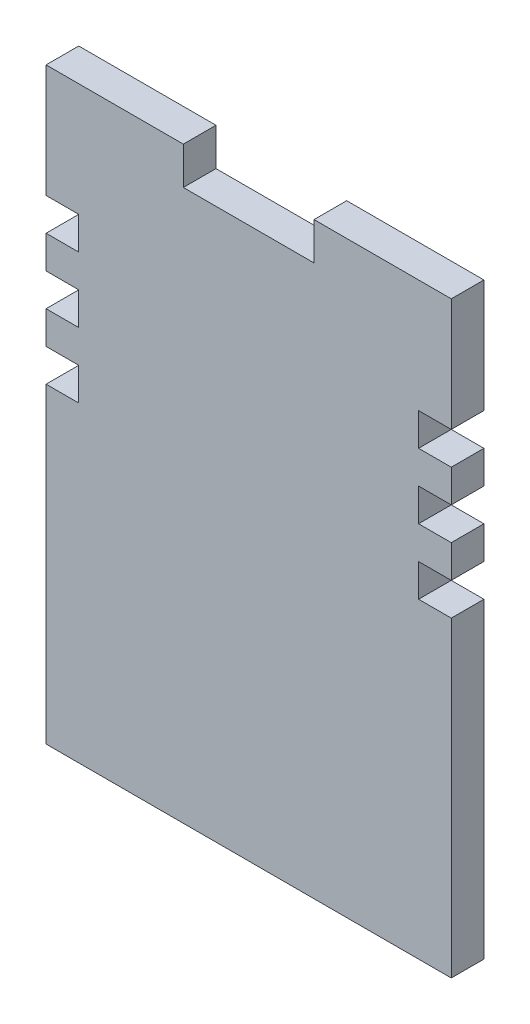
ISO-10303-21;
HEADER;
FILE_DESCRIPTION(('STEP AP214'),'2;1');
FILE_NAME('part.step','',(''),(''),'','','');
FILE_SCHEMA(('AUTOMOTIVE_DESIGN { 1 0 10303 214 1 1 1 1 }'));
ENDSEC;
DATA;
#1=APPLICATION_CONTEXT('core data for automotive mechanical design processes');
#2=APPLICATION_PROTOCOL_DEFINITION('international standard','automotive_design',2000,#1);
#3=PRODUCT_CONTEXT('',#1,'mechanical');
#4=PRODUCT('Part','Part','',(#3));
#5=PRODUCT_RELATED_PRODUCT_CATEGORY('part','',(#4));
#6=PRODUCT_DEFINITION_FORMATION('','',#4);
#7=PRODUCT_DEFINITION_CONTEXT('part definition',#1,'design');
#8=PRODUCT_DEFINITION('design','',#6,#7);
#9=PRODUCT_DEFINITION_SHAPE('','',#8);
#10=(LENGTH_UNIT() NAMED_UNIT(*) SI_UNIT(.MILLI.,.METRE.));
#11=(NAMED_UNIT(*) PLANE_ANGLE_UNIT() SI_UNIT($,.RADIAN.));
#12=(NAMED_UNIT(*) SI_UNIT($,.STERADIAN.) SOLID_ANGLE_UNIT());
#13=UNCERTAINTY_MEASURE_WITH_UNIT(LENGTH_MEASURE(1.E-05),#10,'distance_accuracy_value','');
#14=(GEOMETRIC_REPRESENTATION_CONTEXT(3) GLOBAL_UNCERTAINTY_ASSIGNED_CONTEXT((#13)) GLOBAL_UNIT_ASSIGNED_CONTEXT((#10,
#11,#12)) REPRESENTATION_CONTEXT('',''));
#15=CARTESIAN_POINT('',(0.,0.,0.));
#16=DIRECTION('',(0.,0.,1.));
#17=DIRECTION('',(1.,0.,0.));
#18=AXIS2_PLACEMENT_3D('',#15,#16,#17);
#19=CARTESIAN_POINT('',(0.,76.8543070466195,5.));
#20=DIRECTION('',(0.,1.,0.));
#21=DIRECTION('',(0.,0.,1.));
#22=AXIS2_PLACEMENT_3D('',#19,#20,#21);
#23=PLANE('',#22);
#24=DIRECTION('',(1.,0.,0.));
#25=VECTOR('',#24,1.);
#26=CARTESIAN_POINT('',(0.,76.8543070466195,0.));
#27=LINE('',#26,#25);
#28=CARTESIAN_POINT('',(30.4360171170788,76.8543070466195,0.));
#29=VERTEX_POINT('',#28);
#30=CARTESIAN_POINT('',(92.4360171170788,76.8543070466195,0.));
#31=VERTEX_POINT('',#30);
#32=EDGE_CURVE('E276',#29,#31,#27,.T.);
#33=ORIENTED_EDGE('',*,*,#32,.T.);
#34=DIRECTION('',(0.,0.,-1.));
#35=VECTOR('',#34,1.);
#36=CARTESIAN_POINT('',(92.4360171170788,76.8543070466195,5.));
#37=LINE('',#36,#35);
#38=CARTESIAN_POINT('',(92.4360171170788,76.8543070466195,5.));
#39=VERTEX_POINT('',#38);
#40=EDGE_CURVE('E11',#39,#31,#37,.T.);
#41=ORIENTED_EDGE('',*,*,#40,.F.);
#42=DIRECTION('',(1.,0.,0.));
#43=VECTOR('',#42,1.);
#44=CARTESIAN_POINT('',(0.,76.8543070466195,5.));
#45=LINE('',#44,#43);
#46=CARTESIAN_POINT('',(30.4360171170788,76.8543070466195,5.));
#47=VERTEX_POINT('',#46);
#48=EDGE_CURVE('E165',#47,#39,#45,.T.);
#49=ORIENTED_EDGE('',*,*,#48,.F.);
#50=DIRECTION('',(0.,0.,-1.));
#51=VECTOR('',#50,1.);
#52=CARTESIAN_POINT('',(30.4360171170788,76.8543070466195,5.));
#53=LINE('',#52,#51);
#54=EDGE_CURVE('E272',#47,#29,#53,.T.);
#55=ORIENTED_EDGE('',*,*,#54,.T.);
#56=EDGE_LOOP('',(#33,#41,#49,#55));
#57=FACE_BOUND('',#56,.T.);
#58=ADVANCED_FACE('F37',(#57),#23,.F.);
#59=CARTESIAN_POINT('',(92.4360171170788,0.,5.));
#60=DIRECTION('',(1.,0.,0.));
#61=DIRECTION('',(0.,0.,-1.));
#62=AXIS2_PLACEMENT_3D('',#59,#60,#61);
#63=PLANE('',#62);
#64=DIRECTION('',(0.,-1.,0.));
#65=VECTOR('',#64,1.);
#66=CARTESIAN_POINT('',(92.4360171170788,0.,0.));
#67=LINE('',#66,#65);
#68=CARTESIAN_POINT('',(92.4360171170788,124.544307046619,0.));
#69=VERTEX_POINT('',#68);
#70=EDGE_CURVE('E279',#69,#31,#67,.T.);
#71=ORIENTED_EDGE('',*,*,#70,.F.);
#72=DIRECTION('',(0.,0.,-1.));
#73=VECTOR('',#72,1.);
#74=CARTESIAN_POINT('',(92.4360171170788,124.544307046619,5.));
#75=LINE('',#74,#73);
#76=CARTESIAN_POINT('',(92.4360171170788,124.544307046619,5.));
#77=VERTEX_POINT('',#76);
#78=EDGE_CURVE('E45',#77,#69,#75,.T.);
#79=ORIENTED_EDGE('',*,*,#78,.F.);
#80=DIRECTION('',(0.,-1.,0.));
#81=VECTOR('',#80,1.);
#82=CARTESIAN_POINT('',(92.4360171170788,0.,5.));
#83=LINE('',#82,#81);
#84=EDGE_CURVE('E441',#77,#39,#83,.T.);
#85=ORIENTED_EDGE('',*,*,#84,.T.);
#86=ORIENTED_EDGE('',*,*,#40,.T.);
#87=EDGE_LOOP('',(#71,#79,#85,#86));
#88=FACE_BOUND('',#87,.T.);
#89=ADVANCED_FACE('F428',(#88),#63,.T.);
#90=CARTESIAN_POINT('',(-3.45679893172854E-13,124.544307046619,5.));
#91=DIRECTION('',(0.,1.,0.));
#92=DIRECTION('',(-1.,0.,0.));
#93=AXIS2_PLACEMENT_3D('',#90,#91,#92);
#94=PLANE('',#93);
#95=DIRECTION('',(1.,0.,0.));
#96=VECTOR('',#95,1.);
#97=CARTESIAN_POINT('',(-3.45679893172854E-13,124.544307046619,0.));
#98=LINE('',#97,#96);
#99=CARTESIAN_POINT('',(87.4360171170788,124.544307046619,0.));
#100=VERTEX_POINT('',#99);
#101=EDGE_CURVE('E282',#100,#69,#98,.T.);
#102=ORIENTED_EDGE('',*,*,#101,.F.);
#103=DIRECTION('',(0.,0.,-1.));
#104=VECTOR('',#103,1.);
#105=CARTESIAN_POINT('',(87.4360171170788,124.544307046619,5.));
#106=LINE('',#105,#104);
#107=CARTESIAN_POINT('',(87.4360171170788,124.544307046619,5.));
#108=VERTEX_POINT('',#107);
#109=EDGE_CURVE('E418',#108,#100,#106,.T.);
#110=ORIENTED_EDGE('',*,*,#109,.F.);
#111=DIRECTION('',(1.,0.,0.));
#112=VECTOR('',#111,1.);
#113=CARTESIAN_POINT('',(-3.45679893172854E-13,124.544307046619,5.));
#114=LINE('',#113,#112);
#115=EDGE_CURVE('E425',#108,#77,#114,.T.);
#116=ORIENTED_EDGE('',*,*,#115,.T.);
#117=ORIENTED_EDGE('',*,*,#78,.T.);
#118=EDGE_LOOP('',(#102,#110,#116,#117));
#119=FACE_BOUND('',#118,.T.);
#120=ADVANCED_FACE('F423',(#119),#94,.T.);
#121=CARTESIAN_POINT('',(87.4360171170788,0.,5.));
#122=DIRECTION('',(1.,0.,0.));
#123=DIRECTION('',(0.,0.,-1.));
#124=AXIS2_PLACEMENT_3D('',#121,#122,#123);
#125=PLANE('',#124);
#126=DIRECTION('',(0.,-1.,0.));
#127=VECTOR('',#126,1.);
#128=CARTESIAN_POINT('',(87.4360171170788,0.,0.));
#129=LINE('',#128,#127);
#130=CARTESIAN_POINT('',(87.4360171170788,129.544307046619,0.));
#131=VERTEX_POINT('',#130);
#132=EDGE_CURVE('E285',#131,#100,#129,.T.);
#133=ORIENTED_EDGE('',*,*,#132,.F.);
#134=DIRECTION('',(0.,0.,-1.));
#135=VECTOR('',#134,1.);
#136=CARTESIAN_POINT('',(87.4360171170788,129.544307046619,5.));
#137=LINE('',#136,#135);
#138=CARTESIAN_POINT('',(87.4360171170788,129.544307046619,5.));
#139=VERTEX_POINT('',#138);
#140=EDGE_CURVE('E416',#139,#131,#137,.T.);
#141=ORIENTED_EDGE('',*,*,#140,.F.);
#142=DIRECTION('',(0.,-1.,0.));
#143=VECTOR('',#142,1.);
#144=CARTESIAN_POINT('',(87.4360171170788,0.,5.));
#145=LINE('',#144,#143);
#146=EDGE_CURVE('E438',#139,#108,#145,.T.);
#147=ORIENTED_EDGE('',*,*,#146,.T.);
#148=ORIENTED_EDGE('',*,*,#109,.T.);
#149=EDGE_LOOP('',(#133,#141,#147,#148));
#150=FACE_BOUND('',#149,.T.);
#151=ADVANCED_FACE('F435',(#150),#125,.T.);
#152=CARTESIAN_POINT('',(0.,129.544307046619,5.));
#153=DIRECTION('',(0.,-1.,0.));
#154=DIRECTION('',(0.,0.,-1.));
#155=AXIS2_PLACEMENT_3D('',#152,#153,#154);
#156=PLANE('',#155);
#157=DIRECTION('',(-1.,0.,0.));
#158=VECTOR('',#157,1.);
#159=CARTESIAN_POINT('',(0.,129.544307046619,0.));
#160=LINE('',#159,#158);
#161=CARTESIAN_POINT('',(92.4360171170788,129.544307046619,0.));
#162=VERTEX_POINT('',#161);
#163=EDGE_CURVE('E288',#162,#131,#160,.T.);
#164=ORIENTED_EDGE('',*,*,#163,.F.);
#165=DIRECTION('',(0.,0.,-1.));
#166=VECTOR('',#165,1.);
#167=CARTESIAN_POINT('',(92.4360171170788,129.544307046619,5.));
#168=LINE('',#167,#166);
#169=CARTESIAN_POINT('',(92.4360171170788,129.544307046619,5.));
#170=VERTEX_POINT('',#169);
#171=EDGE_CURVE('E414',#170,#162,#168,.T.);
#172=ORIENTED_EDGE('',*,*,#171,.F.);
#173=DIRECTION('',(-1.,0.,0.));
#174=VECTOR('',#173,1.);
#175=CARTESIAN_POINT('',(0.,129.544307046619,5.));
#176=LINE('',#175,#174);
#177=EDGE_CURVE('E443',#170,#139,#176,.T.);
#178=ORIENTED_EDGE('',*,*,#177,.T.);
#179=ORIENTED_EDGE('',*,*,#140,.T.);
#180=EDGE_LOOP('',(#164,#172,#178,#179));
#181=FACE_BOUND('',#180,.T.);
#182=ADVANCED_FACE('F537',(#181),#156,.T.);
#183=CARTESIAN_POINT('',(92.4360171170788,0.,5.));
#184=DIRECTION('',(1.,0.,0.));
#185=DIRECTION('',(0.,0.,-1.));
#186=AXIS2_PLACEMENT_3D('',#183,#184,#185);
#187=PLANE('',#186);
#188=DIRECTION('',(0.,-1.,0.));
#189=VECTOR('',#188,1.);
#190=CARTESIAN_POINT('',(92.4360171170788,0.,0.));
#191=LINE('',#190,#189);
#192=CARTESIAN_POINT('',(92.4360171170788,134.544307046619,0.));
#193=VERTEX_POINT('',#192);
#194=EDGE_CURVE('E291',#193,#162,#191,.T.);
#195=ORIENTED_EDGE('',*,*,#194,.F.);
#196=DIRECTION('',(0.,0.,-1.));
#197=VECTOR('',#196,1.);
#198=CARTESIAN_POINT('',(92.4360171170788,134.544307046619,5.));
#199=LINE('',#198,#197);
#200=CARTESIAN_POINT('',(92.4360171170788,134.544307046619,5.));
#201=VERTEX_POINT('',#200);
#202=EDGE_CURVE('E412',#201,#193,#199,.T.);
#203=ORIENTED_EDGE('',*,*,#202,.F.);
#204=DIRECTION('',(0.,-1.,0.));
#205=VECTOR('',#204,1.);
#206=CARTESIAN_POINT('',(92.4360171170788,0.,5.));
#207=LINE('',#206,#205);
#208=EDGE_CURVE('E449',#201,#170,#207,.T.);
#209=ORIENTED_EDGE('',*,*,#208,.T.);
#210=ORIENTED_EDGE('',*,*,#171,.T.);
#211=EDGE_LOOP('',(#195,#203,#209,#210));
#212=FACE_BOUND('',#211,.T.);
#213=ADVANCED_FACE('F540',(#212),#187,.T.);
#214=CARTESIAN_POINT('',(0.,134.544307046619,5.));
#215=DIRECTION('',(0.,1.,0.));
#216=DIRECTION('',(0.,0.,1.));
#217=AXIS2_PLACEMENT_3D('',#214,#215,#216);
#218=PLANE('',#217);
#219=DIRECTION('',(1.,0.,0.));
#220=VECTOR('',#219,1.);
#221=CARTESIAN_POINT('',(0.,134.544307046619,0.));
#222=LINE('',#221,#220);
#223=CARTESIAN_POINT('',(87.4360171170788,134.544307046619,0.));
#224=VERTEX_POINT('',#223);
#225=EDGE_CURVE('E294',#224,#193,#222,.T.);
#226=ORIENTED_EDGE('',*,*,#225,.F.);
#227=DIRECTION('',(0.,0.,-1.));
#228=VECTOR('',#227,1.);
#229=CARTESIAN_POINT('',(87.4360171170788,134.544307046619,5.));
#230=LINE('',#229,#228);
#231=CARTESIAN_POINT('',(87.4360171170788,134.544307046619,5.));
#232=VERTEX_POINT('',#231);
#233=EDGE_CURVE('E410',#232,#224,#230,.T.);
#234=ORIENTED_EDGE('',*,*,#233,.F.);
#235=DIRECTION('',(1.,0.,0.));
#236=VECTOR('',#235,1.);
#237=CARTESIAN_POINT('',(0.,134.544307046619,5.));
#238=LINE('',#237,#236);
#239=EDGE_CURVE('E452',#232,#201,#238,.T.);
#240=ORIENTED_EDGE('',*,*,#239,.T.);
#241=ORIENTED_EDGE('',*,*,#202,.T.);
#242=EDGE_LOOP('',(#226,#234,#240,#241));
#243=FACE_BOUND('',#242,.T.);
#244=ADVANCED_FACE('F544',(#243),#218,.T.);
#245=CARTESIAN_POINT('',(87.4360171170788,0.,5.));
#246=DIRECTION('',(1.,0.,0.));
#247=DIRECTION('',(0.,0.,-1.));
#248=AXIS2_PLACEMENT_3D('',#245,#246,#247);
#249=PLANE('',#248);
#250=DIRECTION('',(0.,-1.,0.));
#251=VECTOR('',#250,1.);
#252=CARTESIAN_POINT('',(87.4360171170788,0.,0.));
#253=LINE('',#252,#251);
#254=CARTESIAN_POINT('',(87.4360171170788,139.544307046619,0.));
#255=VERTEX_POINT('',#254);
#256=EDGE_CURVE('E297',#255,#224,#253,.T.);
#257=ORIENTED_EDGE('',*,*,#256,.F.);
#258=DIRECTION('',(0.,0.,-1.));
#259=VECTOR('',#258,1.);
#260=CARTESIAN_POINT('',(87.4360171170788,139.544307046619,5.));
#261=LINE('',#260,#259);
#262=CARTESIAN_POINT('',(87.4360171170788,139.544307046619,5.));
#263=VERTEX_POINT('',#262);
#264=EDGE_CURVE('E408',#263,#255,#261,.T.);
#265=ORIENTED_EDGE('',*,*,#264,.F.);
#266=DIRECTION('',(0.,-1.,0.));
#267=VECTOR('',#266,1.);
#268=CARTESIAN_POINT('',(87.4360171170788,0.,5.));
#269=LINE('',#268,#267);
#270=EDGE_CURVE('E455',#263,#232,#269,.T.);
#271=ORIENTED_EDGE('',*,*,#270,.T.);
#272=ORIENTED_EDGE('',*,*,#233,.T.);
#273=EDGE_LOOP('',(#257,#265,#271,#272));
#274=FACE_BOUND('',#273,.T.);
#275=ADVANCED_FACE('F548',(#274),#249,.T.);
#276=CARTESIAN_POINT('',(0.,139.544307046619,5.));
#277=DIRECTION('',(0.,-1.,0.));
#278=DIRECTION('',(0.,0.,-1.));
#279=AXIS2_PLACEMENT_3D('',#276,#277,#278);
#280=PLANE('',#279);
#281=DIRECTION('',(-1.,0.,0.));
#282=VECTOR('',#281,1.);
#283=CARTESIAN_POINT('',(0.,139.544307046619,0.));
#284=LINE('',#283,#282);
#285=CARTESIAN_POINT('',(92.4360171170788,139.544307046619,0.));
#286=VERTEX_POINT('',#285);
#287=EDGE_CURVE('E300',#286,#255,#284,.T.);
#288=ORIENTED_EDGE('',*,*,#287,.F.);
#289=DIRECTION('',(0.,0.,-1.));
#290=VECTOR('',#289,1.);
#291=CARTESIAN_POINT('',(92.4360171170788,139.544307046619,5.));
#292=LINE('',#291,#290);
#293=CARTESIAN_POINT('',(92.4360171170788,139.544307046619,5.));
#294=VERTEX_POINT('',#293);
#295=EDGE_CURVE('E406',#294,#286,#292,.T.);
#296=ORIENTED_EDGE('',*,*,#295,.F.);
#297=DIRECTION('',(-1.,0.,0.));
#298=VECTOR('',#297,1.);
#299=CARTESIAN_POINT('',(0.,139.544307046619,5.));
#300=LINE('',#299,#298);
#301=EDGE_CURVE('E458',#294,#263,#300,.T.);
#302=ORIENTED_EDGE('',*,*,#301,.T.);
#303=ORIENTED_EDGE('',*,*,#264,.T.);
#304=EDGE_LOOP('',(#288,#296,#302,#303));
#305=FACE_BOUND('',#304,.T.);
#306=ADVANCED_FACE('F552',(#305),#280,.T.);
#307=CARTESIAN_POINT('',(92.4360171170788,0.,5.));
#308=DIRECTION('',(1.,0.,0.));
#309=DIRECTION('',(0.,0.,-1.));
#310=AXIS2_PLACEMENT_3D('',#307,#308,#309);
#311=PLANE('',#310);
#312=DIRECTION('',(0.,-1.,0.));
#313=VECTOR('',#312,1.);
#314=CARTESIAN_POINT('',(92.4360171170788,0.,0.));
#315=LINE('',#314,#313);
#316=CARTESIAN_POINT('',(92.4360171170788,144.54430704662,0.));
#317=VERTEX_POINT('',#316);
#318=EDGE_CURVE('E303',#317,#286,#315,.T.);
#319=ORIENTED_EDGE('',*,*,#318,.F.);
#320=DIRECTION('',(0.,0.,-1.));
#321=VECTOR('',#320,1.);
#322=CARTESIAN_POINT('',(92.4360171170788,144.54430704662,5.));
#323=LINE('',#322,#321);
#324=CARTESIAN_POINT('',(92.4360171170788,144.54430704662,5.));
#325=VERTEX_POINT('',#324);
#326=EDGE_CURVE('E404',#325,#317,#323,.T.);
#327=ORIENTED_EDGE('',*,*,#326,.F.);
#328=DIRECTION('',(0.,-1.,0.));
#329=VECTOR('',#328,1.);
#330=CARTESIAN_POINT('',(92.4360171170788,0.,5.));
#331=LINE('',#330,#329);
#332=EDGE_CURVE('E461',#325,#294,#331,.T.);
#333=ORIENTED_EDGE('',*,*,#332,.T.);
#334=ORIENTED_EDGE('',*,*,#295,.T.);
#335=EDGE_LOOP('',(#319,#327,#333,#334));
#336=FACE_BOUND('',#335,.T.);
#337=ADVANCED_FACE('F556',(#336),#311,.T.);
#338=CARTESIAN_POINT('',(0.,144.54430704662,5.));
#339=DIRECTION('',(0.,1.,0.));
#340=DIRECTION('',(0.,0.,1.));
#341=AXIS2_PLACEMENT_3D('',#338,#339,#340);
#342=PLANE('',#341);
#343=DIRECTION('',(1.,0.,0.));
#344=VECTOR('',#343,1.);
#345=CARTESIAN_POINT('',(0.,144.54430704662,0.));
#346=LINE('',#345,#344);
#347=CARTESIAN_POINT('',(87.4360171170788,144.54430704662,0.));
#348=VERTEX_POINT('',#347);
#349=EDGE_CURVE('E306',#348,#317,#346,.T.);
#350=ORIENTED_EDGE('',*,*,#349,.F.);
#351=DIRECTION('',(0.,0.,-1.));
#352=VECTOR('',#351,1.);
#353=CARTESIAN_POINT('',(87.4360171170788,144.54430704662,5.));
#354=LINE('',#353,#352);
#355=CARTESIAN_POINT('',(87.4360171170788,144.54430704662,5.));
#356=VERTEX_POINT('',#355);
#357=EDGE_CURVE('E402',#356,#348,#354,.T.);
#358=ORIENTED_EDGE('',*,*,#357,.F.);
#359=DIRECTION('',(1.,0.,0.));
#360=VECTOR('',#359,1.);
#361=CARTESIAN_POINT('',(0.,144.54430704662,5.));
#362=LINE('',#361,#360);
#363=EDGE_CURVE('E464',#356,#325,#362,.T.);
#364=ORIENTED_EDGE('',*,*,#363,.T.);
#365=ORIENTED_EDGE('',*,*,#326,.T.);
#366=EDGE_LOOP('',(#350,#358,#364,#365));
#367=FACE_BOUND('',#366,.T.);
#368=ADVANCED_FACE('F560',(#367),#342,.T.);
#369=CARTESIAN_POINT('',(87.4360171170788,0.,5.));
#370=DIRECTION('',(1.,0.,0.));
#371=DIRECTION('',(0.,0.,-1.));
#372=AXIS2_PLACEMENT_3D('',#369,#370,#371);
#373=PLANE('',#372);
#374=DIRECTION('',(0.,-1.,0.));
#375=VECTOR('',#374,1.);
#376=CARTESIAN_POINT('',(87.4360171170788,0.,0.));
#377=LINE('',#376,#375);
#378=CARTESIAN_POINT('',(87.4360171170788,149.54430704662,0.));
#379=VERTEX_POINT('',#378);
#380=EDGE_CURVE('E309',#379,#348,#377,.T.);
#381=ORIENTED_EDGE('',*,*,#380,.F.);
#382=DIRECTION('',(0.,0.,-1.));
#383=VECTOR('',#382,1.);
#384=CARTESIAN_POINT('',(87.4360171170788,149.54430704662,5.));
#385=LINE('',#384,#383);
#386=CARTESIAN_POINT('',(87.4360171170788,149.54430704662,5.));
#387=VERTEX_POINT('',#386);
#388=EDGE_CURVE('E400',#387,#379,#385,.T.);
#389=ORIENTED_EDGE('',*,*,#388,.F.);
#390=DIRECTION('',(0.,-1.,0.));
#391=VECTOR('',#390,1.);
#392=CARTESIAN_POINT('',(87.4360171170788,0.,5.));
#393=LINE('',#392,#391);
#394=EDGE_CURVE('E467',#387,#356,#393,.T.);
#395=ORIENTED_EDGE('',*,*,#394,.T.);
#396=ORIENTED_EDGE('',*,*,#357,.T.);
#397=EDGE_LOOP('',(#381,#389,#395,#396));
#398=FACE_BOUND('',#397,.T.);
#399=ADVANCED_FACE('F564',(#398),#373,.T.);
#400=CARTESIAN_POINT('',(0.,149.54430704662,5.));
#401=DIRECTION('',(0.,-1.,0.));
#402=DIRECTION('',(0.,0.,-1.));
#403=AXIS2_PLACEMENT_3D('',#400,#401,#402);
#404=PLANE('',#403);
#405=DIRECTION('',(-1.,0.,0.));
#406=VECTOR('',#405,1.);
#407=CARTESIAN_POINT('',(0.,149.54430704662,0.));
#408=LINE('',#407,#406);
#409=CARTESIAN_POINT('',(92.4360171170788,149.54430704662,0.));
#410=VERTEX_POINT('',#409);
#411=EDGE_CURVE('E312',#410,#379,#408,.T.);
#412=ORIENTED_EDGE('',*,*,#411,.F.);
#413=DIRECTION('',(0.,0.,-1.));
#414=VECTOR('',#413,1.);
#415=CARTESIAN_POINT('',(92.4360171170788,149.54430704662,5.));
#416=LINE('',#415,#414);
#417=CARTESIAN_POINT('',(92.4360171170788,149.54430704662,5.));
#418=VERTEX_POINT('',#417);
#419=EDGE_CURVE('E398',#418,#410,#416,.T.);
#420=ORIENTED_EDGE('',*,*,#419,.F.);
#421=DIRECTION('',(-1.,0.,0.));
#422=VECTOR('',#421,1.);
#423=CARTESIAN_POINT('',(0.,149.54430704662,5.));
#424=LINE('',#423,#422);
#425=EDGE_CURVE('E470',#418,#387,#424,.T.);
#426=ORIENTED_EDGE('',*,*,#425,.T.);
#427=ORIENTED_EDGE('',*,*,#388,.T.);
#428=EDGE_LOOP('',(#412,#420,#426,#427));
#429=FACE_BOUND('',#428,.T.);
#430=ADVANCED_FACE('F568',(#429),#404,.T.);
#431=CARTESIAN_POINT('',(92.4360171170787,0.,5.));
#432=DIRECTION('',(1.,0.,0.));
#433=DIRECTION('',(0.,1.,0.));
#434=AXIS2_PLACEMENT_3D('',#431,#432,#433);
#435=PLANE('',#434);
#436=DIRECTION('',(0.,-1.,0.));
#437=VECTOR('',#436,1.);
#438=CARTESIAN_POINT('',(92.4360171170787,0.,0.));
#439=LINE('',#438,#437);
#440=CARTESIAN_POINT('',(92.4360171170788,166.854307046619,0.));
#441=VERTEX_POINT('',#440);
#442=EDGE_CURVE('E315',#441,#410,#439,.T.);
#443=ORIENTED_EDGE('',*,*,#442,.F.);
#444=DIRECTION('',(0.,0.,-1.));
#445=VECTOR('',#444,1.);
#446=CARTESIAN_POINT('',(92.4360171170788,166.854307046619,5.));
#447=LINE('',#446,#445);
#448=CARTESIAN_POINT('',(92.4360171170788,166.854307046619,5.));
#449=VERTEX_POINT('',#448);
#450=EDGE_CURVE('E396',#449,#441,#447,.T.);
#451=ORIENTED_EDGE('',*,*,#450,.F.);
#452=DIRECTION('',(0.,-1.,0.));
#453=VECTOR('',#452,1.);
#454=CARTESIAN_POINT('',(92.4360171170787,0.,5.));
#455=LINE('',#454,#453);
#456=EDGE_CURVE('E473',#449,#418,#455,.T.);
#457=ORIENTED_EDGE('',*,*,#456,.T.);
#458=ORIENTED_EDGE('',*,*,#419,.T.);
#459=EDGE_LOOP('',(#443,#451,#457,#458));
#460=FACE_BOUND('',#459,.T.);
#461=ADVANCED_FACE('F572',(#460),#435,.T.);
#462=CARTESIAN_POINT('',(0.,166.854307046619,5.));
#463=DIRECTION('',(0.,1.,0.));
#464=DIRECTION('',(0.,0.,1.));
#465=AXIS2_PLACEMENT_3D('',#462,#463,#464);
#466=PLANE('',#465);
#467=DIRECTION('',(1.,0.,0.));
#468=VECTOR('',#467,1.);
#469=CARTESIAN_POINT('',(0.,166.854307046619,0.));
#470=LINE('',#469,#468);
#471=CARTESIAN_POINT('',(71.4360171170788,166.854307046619,0.));
#472=VERTEX_POINT('',#471);
#473=EDGE_CURVE('E318',#472,#441,#470,.T.);
#474=ORIENTED_EDGE('',*,*,#473,.F.);
#475=DIRECTION('',(0.,0.,-1.));
#476=VECTOR('',#475,1.);
#477=CARTESIAN_POINT('',(71.4360171170788,166.854307046619,5.));
#478=LINE('',#477,#476);
#479=CARTESIAN_POINT('',(71.4360171170788,166.854307046619,5.));
#480=VERTEX_POINT('',#479);
#481=EDGE_CURVE('E394',#480,#472,#478,.T.);
#482=ORIENTED_EDGE('',*,*,#481,.F.);
#483=DIRECTION('',(1.,0.,0.));
#484=VECTOR('',#483,1.);
#485=CARTESIAN_POINT('',(0.,166.854307046619,5.));
#486=LINE('',#485,#484);
#487=EDGE_CURVE('E476',#480,#449,#486,.T.);
#488=ORIENTED_EDGE('',*,*,#487,.T.);
#489=ORIENTED_EDGE('',*,*,#450,.T.);
#490=EDGE_LOOP('',(#474,#482,#488,#489));
#491=FACE_BOUND('',#490,.T.);
#492=ADVANCED_FACE('F576',(#491),#466,.T.);
#493=CARTESIAN_POINT('',(71.4360171170788,0.,5.));
#494=DIRECTION('',(-1.,0.,0.));
#495=DIRECTION('',(0.,0.,1.));
#496=AXIS2_PLACEMENT_3D('',#493,#494,#495);
#497=PLANE('',#496);
#498=DIRECTION('',(0.,1.,0.));
#499=VECTOR('',#498,1.);
#500=CARTESIAN_POINT('',(71.4360171170788,0.,0.));
#501=LINE('',#500,#499);
#502=CARTESIAN_POINT('',(71.4360171170788,161.108741685627,0.));
#503=VERTEX_POINT('',#502);
#504=EDGE_CURVE('E321',#503,#472,#501,.T.);
#505=ORIENTED_EDGE('',*,*,#504,.F.);
#506=DIRECTION('',(0.,0.,-1.));
#507=VECTOR('',#506,1.);
#508=CARTESIAN_POINT('',(71.4360171170788,161.108741685627,5.));
#509=LINE('',#508,#507);
#510=CARTESIAN_POINT('',(71.4360171170788,161.108741685627,5.));
#511=VERTEX_POINT('',#510);
#512=EDGE_CURVE('E392',#511,#503,#509,.T.);
#513=ORIENTED_EDGE('',*,*,#512,.F.);
#514=DIRECTION('',(0.,1.,0.));
#515=VECTOR('',#514,1.);
#516=CARTESIAN_POINT('',(71.4360171170788,0.,5.));
#517=LINE('',#516,#515);
#518=EDGE_CURVE('E479',#511,#480,#517,.T.);
#519=ORIENTED_EDGE('',*,*,#518,.T.);
#520=ORIENTED_EDGE('',*,*,#481,.T.);
#521=EDGE_LOOP('',(#505,#513,#519,#520));
#522=FACE_BOUND('',#521,.T.);
#523=ADVANCED_FACE('F580',(#522),#497,.T.);
#524=CARTESIAN_POINT('',(0.,161.108741685627,5.));
#525=DIRECTION('',(0.,-1.,0.));
#526=DIRECTION('',(0.,0.,-1.));
#527=AXIS2_PLACEMENT_3D('',#524,#525,#526);
#528=PLANE('',#527);
#529=DIRECTION('',(-1.,0.,0.));
#530=VECTOR('',#529,1.);
#531=CARTESIAN_POINT('',(0.,161.108741685627,0.));
#532=LINE('',#531,#530);
#533=CARTESIAN_POINT('',(51.4360171170788,161.108741685627,0.));
#534=VERTEX_POINT('',#533);
#535=EDGE_CURVE('E324',#503,#534,#532,.T.);
#536=ORIENTED_EDGE('',*,*,#535,.T.);
#537=DIRECTION('',(0.,0.,-1.));
#538=VECTOR('',#537,1.);
#539=CARTESIAN_POINT('',(51.4360171170788,161.108741685627,5.));
#540=LINE('',#539,#538);
#541=CARTESIAN_POINT('',(51.4360171170788,161.108741685627,5.));
#542=VERTEX_POINT('',#541);
#543=EDGE_CURVE('E389',#542,#534,#540,.T.);
#544=ORIENTED_EDGE('',*,*,#543,.F.);
#545=DIRECTION('',(-1.,0.,0.));
#546=VECTOR('',#545,1.);
#547=CARTESIAN_POINT('',(0.,161.108741685627,5.));
#548=LINE('',#547,#546);
#549=EDGE_CURVE('E482',#511,#542,#548,.T.);
#550=ORIENTED_EDGE('',*,*,#549,.F.);
#551=ORIENTED_EDGE('',*,*,#512,.T.);
#552=EDGE_LOOP('',(#536,#544,#550,#551));
#553=FACE_BOUND('',#552,.T.);
#554=ADVANCED_FACE('F584',(#553),#528,.F.);
#555=CARTESIAN_POINT('',(51.4360171170788,0.,5.));
#556=DIRECTION('',(-1.,0.,0.));
#557=DIRECTION('',(0.,0.,1.));
#558=AXIS2_PLACEMENT_3D('',#555,#556,#557);
#559=PLANE('',#558);
#560=DIRECTION('',(0.,1.,0.));
#561=VECTOR('',#560,1.);
#562=CARTESIAN_POINT('',(51.4360171170788,0.,0.));
#563=LINE('',#562,#561);
#564=CARTESIAN_POINT('',(51.4360171170788,166.854307046619,0.));
#565=VERTEX_POINT('',#564);
#566=EDGE_CURVE('E326',#534,#565,#563,.T.);
#567=ORIENTED_EDGE('',*,*,#566,.T.);
#568=DIRECTION('',(0.,0.,-1.));
#569=VECTOR('',#568,1.);
#570=CARTESIAN_POINT('',(51.4360171170788,166.854307046619,5.));
#571=LINE('',#570,#569);
#572=CARTESIAN_POINT('',(51.4360171170788,166.854307046619,5.));
#573=VERTEX_POINT('',#572);
#574=EDGE_CURVE('E386',#573,#565,#571,.T.);
#575=ORIENTED_EDGE('',*,*,#574,.F.);
#576=DIRECTION('',(0.,1.,0.));
#577=VECTOR('',#576,1.);
#578=CARTESIAN_POINT('',(51.4360171170788,0.,5.));
#579=LINE('',#578,#577);
#580=EDGE_CURVE('E484',#542,#573,#579,.T.);
#581=ORIENTED_EDGE('',*,*,#580,.F.);
#582=ORIENTED_EDGE('',*,*,#543,.T.);
#583=EDGE_LOOP('',(#567,#575,#581,#582));
#584=FACE_BOUND('',#583,.T.);
#585=ADVANCED_FACE('F588',(#584),#559,.F.);
#586=CARTESIAN_POINT('',(0.,166.854307046619,5.));
#587=DIRECTION('',(0.,-1.,0.));
#588=DIRECTION('',(0.,0.,-1.));
#589=AXIS2_PLACEMENT_3D('',#586,#587,#588);
#590=PLANE('',#589);
#591=DIRECTION('',(-1.,0.,0.));
#592=VECTOR('',#591,1.);
#593=CARTESIAN_POINT('',(0.,166.854307046619,0.));
#594=LINE('',#593,#592);
#595=CARTESIAN_POINT('',(30.4360171170788,166.854307046619,0.));
#596=VERTEX_POINT('',#595);
#597=EDGE_CURVE('E328',#565,#596,#594,.T.);
#598=ORIENTED_EDGE('',*,*,#597,.T.);
#599=DIRECTION('',(0.,0.,-1.));
#600=VECTOR('',#599,1.);
#601=CARTESIAN_POINT('',(30.4360171170788,166.854307046619,5.));
#602=LINE('',#601,#600);
#603=CARTESIAN_POINT('',(30.4360171170788,166.854307046619,5.));
#604=VERTEX_POINT('',#603);
#605=EDGE_CURVE('E383',#604,#596,#602,.T.);
#606=ORIENTED_EDGE('',*,*,#605,.F.);
#607=DIRECTION('',(-1.,0.,0.));
#608=VECTOR('',#607,1.);
#609=CARTESIAN_POINT('',(0.,166.854307046619,5.));
#610=LINE('',#609,#608);
#611=EDGE_CURVE('E486',#573,#604,#610,.T.);
#612=ORIENTED_EDGE('',*,*,#611,.F.);
#613=ORIENTED_EDGE('',*,*,#574,.T.);
#614=EDGE_LOOP('',(#598,#606,#612,#613));
#615=FACE_BOUND('',#614,.T.);
#616=ADVANCED_FACE('F592',(#615),#590,.F.);
#617=CARTESIAN_POINT('',(30.4360171170788,0.,5.));
#618=DIRECTION('',(1.,0.,0.));
#619=DIRECTION('',(0.,1.,0.));
#620=AXIS2_PLACEMENT_3D('',#617,#618,#619);
#621=PLANE('',#620);
#622=DIRECTION('',(0.,-1.,0.));
#623=VECTOR('',#622,1.);
#624=CARTESIAN_POINT('',(30.4360171170788,0.,0.));
#625=LINE('',#624,#623);
#626=CARTESIAN_POINT('',(30.4360171170788,149.54430704662,0.));
#627=VERTEX_POINT('',#626);
#628=EDGE_CURVE('E330',#596,#627,#625,.T.);
#629=ORIENTED_EDGE('',*,*,#628,.T.);
#630=DIRECTION('',(0.,0.,-1.));
#631=VECTOR('',#630,1.);
#632=CARTESIAN_POINT('',(30.4360171170788,149.54430704662,5.));
#633=LINE('',#632,#631);
#634=CARTESIAN_POINT('',(30.4360171170788,149.54430704662,5.));
#635=VERTEX_POINT('',#634);
#636=EDGE_CURVE('E380',#635,#627,#633,.T.);
#637=ORIENTED_EDGE('',*,*,#636,.F.);
#638=DIRECTION('',(0.,-1.,0.));
#639=VECTOR('',#638,1.);
#640=CARTESIAN_POINT('',(30.4360171170788,0.,5.));
#641=LINE('',#640,#639);
#642=EDGE_CURVE('E488',#604,#635,#641,.T.);
#643=ORIENTED_EDGE('',*,*,#642,.F.);
#644=ORIENTED_EDGE('',*,*,#605,.T.);
#645=EDGE_LOOP('',(#629,#637,#643,#644));
#646=FACE_BOUND('',#645,.T.);
#647=ADVANCED_FACE('F596',(#646),#621,.F.);
#648=CARTESIAN_POINT('',(0.,149.54430704662,5.));
#649=DIRECTION('',(0.,1.,0.));
#650=DIRECTION('',(0.,0.,1.));
#651=AXIS2_PLACEMENT_3D('',#648,#649,#650);
#652=PLANE('',#651);
#653=DIRECTION('',(1.,0.,0.));
#654=VECTOR('',#653,1.);
#655=CARTESIAN_POINT('',(0.,149.54430704662,0.));
#656=LINE('',#655,#654);
#657=CARTESIAN_POINT('',(35.4360171170788,149.54430704662,0.));
#658=VERTEX_POINT('',#657);
#659=EDGE_CURVE('E332',#627,#658,#656,.T.);
#660=ORIENTED_EDGE('',*,*,#659,.T.);
#661=DIRECTION('',(0.,0.,-1.));
#662=VECTOR('',#661,1.);
#663=CARTESIAN_POINT('',(35.4360171170788,149.54430704662,5.));
#664=LINE('',#663,#662);
#665=CARTESIAN_POINT('',(35.4360171170788,149.54430704662,5.));
#666=VERTEX_POINT('',#665);
#667=EDGE_CURVE('E377',#666,#658,#664,.T.);
#668=ORIENTED_EDGE('',*,*,#667,.F.);
#669=DIRECTION('',(1.,0.,0.));
#670=VECTOR('',#669,1.);
#671=CARTESIAN_POINT('',(0.,149.54430704662,5.));
#672=LINE('',#671,#670);
#673=EDGE_CURVE('E490',#635,#666,#672,.T.);
#674=ORIENTED_EDGE('',*,*,#673,.F.);
#675=ORIENTED_EDGE('',*,*,#636,.T.);
#676=EDGE_LOOP('',(#660,#668,#674,#675));
#677=FACE_BOUND('',#676,.T.);
#678=ADVANCED_FACE('F600',(#677),#652,.F.);
#679=CARTESIAN_POINT('',(35.4360171170786,0.,5.));
#680=DIRECTION('',(1.,0.,0.));
#681=DIRECTION('',(0.,1.,0.));
#682=AXIS2_PLACEMENT_3D('',#679,#680,#681);
#683=PLANE('',#682);
#684=DIRECTION('',(0.,-1.,0.));
#685=VECTOR('',#684,1.);
#686=CARTESIAN_POINT('',(35.4360171170786,0.,0.));
#687=LINE('',#686,#685);
#688=CARTESIAN_POINT('',(35.4360171170788,144.54430704662,0.));
#689=VERTEX_POINT('',#688);
#690=EDGE_CURVE('E334',#658,#689,#687,.T.);
#691=ORIENTED_EDGE('',*,*,#690,.T.);
#692=DIRECTION('',(0.,0.,-1.));
#693=VECTOR('',#692,1.);
#694=CARTESIAN_POINT('',(35.4360171170788,144.54430704662,5.));
#695=LINE('',#694,#693);
#696=CARTESIAN_POINT('',(35.4360171170788,144.54430704662,5.));
#697=VERTEX_POINT('',#696);
#698=EDGE_CURVE('E374',#697,#689,#695,.T.);
#699=ORIENTED_EDGE('',*,*,#698,.F.);
#700=DIRECTION('',(0.,-1.,0.));
#701=VECTOR('',#700,1.);
#702=CARTESIAN_POINT('',(35.4360171170786,0.,5.));
#703=LINE('',#702,#701);
#704=EDGE_CURVE('E492',#666,#697,#703,.T.);
#705=ORIENTED_EDGE('',*,*,#704,.F.);
#706=ORIENTED_EDGE('',*,*,#667,.T.);
#707=EDGE_LOOP('',(#691,#699,#705,#706));
#708=FACE_BOUND('',#707,.T.);
#709=ADVANCED_FACE('F604',(#708),#683,.F.);
#710=CARTESIAN_POINT('',(0.,144.54430704662,5.));
#711=DIRECTION('',(0.,-1.,0.));
#712=DIRECTION('',(0.,0.,-1.));
#713=AXIS2_PLACEMENT_3D('',#710,#711,#712);
#714=PLANE('',#713);
#715=DIRECTION('',(-1.,0.,0.));
#716=VECTOR('',#715,1.);
#717=CARTESIAN_POINT('',(0.,144.54430704662,0.));
#718=LINE('',#717,#716);
#719=CARTESIAN_POINT('',(30.4360171170788,144.54430704662,0.));
#720=VERTEX_POINT('',#719);
#721=EDGE_CURVE('E336',#689,#720,#718,.T.);
#722=ORIENTED_EDGE('',*,*,#721,.T.);
#723=DIRECTION('',(0.,0.,-1.));
#724=VECTOR('',#723,1.);
#725=CARTESIAN_POINT('',(30.4360171170788,144.54430704662,5.));
#726=LINE('',#725,#724);
#727=CARTESIAN_POINT('',(30.4360171170788,144.54430704662,5.));
#728=VERTEX_POINT('',#727);
#729=EDGE_CURVE('E371',#728,#720,#726,.T.);
#730=ORIENTED_EDGE('',*,*,#729,.F.);
#731=DIRECTION('',(-1.,0.,0.));
#732=VECTOR('',#731,1.);
#733=CARTESIAN_POINT('',(0.,144.54430704662,5.));
#734=LINE('',#733,#732);
#735=EDGE_CURVE('E494',#697,#728,#734,.T.);
#736=ORIENTED_EDGE('',*,*,#735,.F.);
#737=ORIENTED_EDGE('',*,*,#698,.T.);
#738=EDGE_LOOP('',(#722,#730,#736,#737));
#739=FACE_BOUND('',#738,.T.);
#740=ADVANCED_FACE('F608',(#739),#714,.F.);
#741=CARTESIAN_POINT('',(30.4360171170787,0.,5.));
#742=DIRECTION('',(1.,0.,0.));
#743=DIRECTION('',(0.,1.,0.));
#744=AXIS2_PLACEMENT_3D('',#741,#742,#743);
#745=PLANE('',#744);
#746=DIRECTION('',(0.,-1.,0.));
#747=VECTOR('',#746,1.);
#748=CARTESIAN_POINT('',(30.4360171170787,0.,0.));
#749=LINE('',#748,#747);
#750=CARTESIAN_POINT('',(30.4360171170788,139.544307046619,0.));
#751=VERTEX_POINT('',#750);
#752=EDGE_CURVE('E338',#720,#751,#749,.T.);
#753=ORIENTED_EDGE('',*,*,#752,.T.);
#754=DIRECTION('',(0.,0.,-1.));
#755=VECTOR('',#754,1.);
#756=CARTESIAN_POINT('',(30.4360171170788,139.544307046619,5.));
#757=LINE('',#756,#755);
#758=CARTESIAN_POINT('',(30.4360171170788,139.544307046619,5.));
#759=VERTEX_POINT('',#758);
#760=EDGE_CURVE('E368',#759,#751,#757,.T.);
#761=ORIENTED_EDGE('',*,*,#760,.F.);
#762=DIRECTION('',(0.,-1.,0.));
#763=VECTOR('',#762,1.);
#764=CARTESIAN_POINT('',(30.4360171170787,0.,5.));
#765=LINE('',#764,#763);
#766=EDGE_CURVE('E496',#728,#759,#765,.T.);
#767=ORIENTED_EDGE('',*,*,#766,.F.);
#768=ORIENTED_EDGE('',*,*,#729,.T.);
#769=EDGE_LOOP('',(#753,#761,#767,#768));
#770=FACE_BOUND('',#769,.T.);
#771=ADVANCED_FACE('F612',(#770),#745,.F.);
#772=CARTESIAN_POINT('',(0.,139.544307046619,5.));
#773=DIRECTION('',(0.,1.,0.));
#774=DIRECTION('',(0.,0.,1.));
#775=AXIS2_PLACEMENT_3D('',#772,#773,#774);
#776=PLANE('',#775);
#777=DIRECTION('',(1.,0.,0.));
#778=VECTOR('',#777,1.);
#779=CARTESIAN_POINT('',(0.,139.544307046619,0.));
#780=LINE('',#779,#778);
#781=CARTESIAN_POINT('',(35.4360171170788,139.544307046619,0.));
#782=VERTEX_POINT('',#781);
#783=EDGE_CURVE('E340',#751,#782,#780,.T.);
#784=ORIENTED_EDGE('',*,*,#783,.T.);
#785=DIRECTION('',(0.,0.,-1.));
#786=VECTOR('',#785,1.);
#787=CARTESIAN_POINT('',(35.4360171170788,139.544307046619,5.));
#788=LINE('',#787,#786);
#789=CARTESIAN_POINT('',(35.4360171170788,139.544307046619,5.));
#790=VERTEX_POINT('',#789);
#791=EDGE_CURVE('E365',#790,#782,#788,.T.);
#792=ORIENTED_EDGE('',*,*,#791,.F.);
#793=DIRECTION('',(1.,0.,0.));
#794=VECTOR('',#793,1.);
#795=CARTESIAN_POINT('',(0.,139.544307046619,5.));
#796=LINE('',#795,#794);
#797=EDGE_CURVE('E498',#759,#790,#796,.T.);
#798=ORIENTED_EDGE('',*,*,#797,.F.);
#799=ORIENTED_EDGE('',*,*,#760,.T.);
#800=EDGE_LOOP('',(#784,#792,#798,#799));
#801=FACE_BOUND('',#800,.T.);
#802=ADVANCED_FACE('F616',(#801),#776,.F.);
#803=CARTESIAN_POINT('',(35.4360171170788,0.,5.));
#804=DIRECTION('',(1.,0.,0.));
#805=DIRECTION('',(0.,0.,-1.));
#806=AXIS2_PLACEMENT_3D('',#803,#804,#805);
#807=PLANE('',#806);
#808=DIRECTION('',(0.,-1.,0.));
#809=VECTOR('',#808,1.);
#810=CARTESIAN_POINT('',(35.4360171170788,0.,0.));
#811=LINE('',#810,#809);
#812=CARTESIAN_POINT('',(35.4360171170788,134.544307046619,0.));
#813=VERTEX_POINT('',#812);
#814=EDGE_CURVE('E342',#782,#813,#811,.T.);
#815=ORIENTED_EDGE('',*,*,#814,.T.);
#816=DIRECTION('',(0.,0.,-1.));
#817=VECTOR('',#816,1.);
#818=CARTESIAN_POINT('',(35.4360171170788,134.544307046619,5.));
#819=LINE('',#818,#817);
#820=CARTESIAN_POINT('',(35.4360171170788,134.544307046619,5.));
#821=VERTEX_POINT('',#820);
#822=EDGE_CURVE('E362',#821,#813,#819,.T.);
#823=ORIENTED_EDGE('',*,*,#822,.F.);
#824=DIRECTION('',(0.,-1.,0.));
#825=VECTOR('',#824,1.);
#826=CARTESIAN_POINT('',(35.4360171170788,0.,5.));
#827=LINE('',#826,#825);
#828=EDGE_CURVE('E500',#790,#821,#827,.T.);
#829=ORIENTED_EDGE('',*,*,#828,.F.);
#830=ORIENTED_EDGE('',*,*,#791,.T.);
#831=EDGE_LOOP('',(#815,#823,#829,#830));
#832=FACE_BOUND('',#831,.T.);
#833=ADVANCED_FACE('F620',(#832),#807,.F.);
#834=CARTESIAN_POINT('',(0.,134.544307046619,5.));
#835=DIRECTION('',(0.,-1.,0.));
#836=DIRECTION('',(0.,0.,-1.));
#837=AXIS2_PLACEMENT_3D('',#834,#835,#836);
#838=PLANE('',#837);
#839=DIRECTION('',(-1.,0.,0.));
#840=VECTOR('',#839,1.);
#841=CARTESIAN_POINT('',(0.,134.544307046619,0.));
#842=LINE('',#841,#840);
#843=CARTESIAN_POINT('',(30.4360171170788,134.544307046619,0.));
#844=VERTEX_POINT('',#843);
#845=EDGE_CURVE('E344',#813,#844,#842,.T.);
#846=ORIENTED_EDGE('',*,*,#845,.T.);
#847=DIRECTION('',(0.,0.,-1.));
#848=VECTOR('',#847,1.);
#849=CARTESIAN_POINT('',(30.4360171170788,134.544307046619,5.));
#850=LINE('',#849,#848);
#851=CARTESIAN_POINT('',(30.4360171170788,134.544307046619,5.));
#852=VERTEX_POINT('',#851);
#853=EDGE_CURVE('E359',#852,#844,#850,.T.);
#854=ORIENTED_EDGE('',*,*,#853,.F.);
#855=DIRECTION('',(-1.,0.,0.));
#856=VECTOR('',#855,1.);
#857=CARTESIAN_POINT('',(0.,134.544307046619,5.));
#858=LINE('',#857,#856);
#859=EDGE_CURVE('E502',#821,#852,#858,.T.);
#860=ORIENTED_EDGE('',*,*,#859,.F.);
#861=ORIENTED_EDGE('',*,*,#822,.T.);
#862=EDGE_LOOP('',(#846,#854,#860,#861));
#863=FACE_BOUND('',#862,.T.);
#864=ADVANCED_FACE('F624',(#863),#838,.F.);
#865=CARTESIAN_POINT('',(30.4360171170787,0.,5.));
#866=DIRECTION('',(1.,0.,0.));
#867=DIRECTION('',(0.,1.,0.));
#868=AXIS2_PLACEMENT_3D('',#865,#866,#867);
#869=PLANE('',#868);
#870=DIRECTION('',(0.,-1.,0.));
#871=VECTOR('',#870,1.);
#872=CARTESIAN_POINT('',(30.4360171170787,0.,0.));
#873=LINE('',#872,#871);
#874=CARTESIAN_POINT('',(30.4360171170788,129.544307046619,0.));
#875=VERTEX_POINT('',#874);
#876=EDGE_CURVE('E346',#844,#875,#873,.T.);
#877=ORIENTED_EDGE('',*,*,#876,.T.);
#878=DIRECTION('',(0.,0.,-1.));
#879=VECTOR('',#878,1.);
#880=CARTESIAN_POINT('',(30.4360171170788,129.544307046619,5.));
#881=LINE('',#880,#879);
#882=CARTESIAN_POINT('',(30.4360171170788,129.544307046619,5.));
#883=VERTEX_POINT('',#882);
#884=EDGE_CURVE('E356',#883,#875,#881,.T.);
#885=ORIENTED_EDGE('',*,*,#884,.F.);
#886=DIRECTION('',(0.,-1.,0.));
#887=VECTOR('',#886,1.);
#888=CARTESIAN_POINT('',(30.4360171170787,0.,5.));
#889=LINE('',#888,#887);
#890=EDGE_CURVE('E504',#852,#883,#889,.T.);
#891=ORIENTED_EDGE('',*,*,#890,.F.);
#892=ORIENTED_EDGE('',*,*,#853,.T.);
#893=EDGE_LOOP('',(#877,#885,#891,#892));
#894=FACE_BOUND('',#893,.T.);
#895=ADVANCED_FACE('F510',(#894),#869,.F.);
#896=CARTESIAN_POINT('',(0.,129.544307046619,5.));
#897=DIRECTION('',(0.,1.,0.));
#898=DIRECTION('',(0.,0.,1.));
#899=AXIS2_PLACEMENT_3D('',#896,#897,#898);
#900=PLANE('',#899);
#901=DIRECTION('',(1.,0.,0.));
#902=VECTOR('',#901,1.);
#903=CARTESIAN_POINT('',(0.,129.544307046619,0.));
#904=LINE('',#903,#902);
#905=CARTESIAN_POINT('',(35.4360171170788,129.544307046619,0.));
#906=VERTEX_POINT('',#905);
#907=EDGE_CURVE('E348',#875,#906,#904,.T.);
#908=ORIENTED_EDGE('',*,*,#907,.T.);
#909=DIRECTION('',(0.,0.,-1.));
#910=VECTOR('',#909,1.);
#911=CARTESIAN_POINT('',(35.4360171170788,129.544307046619,5.));
#912=LINE('',#911,#910);
#913=CARTESIAN_POINT('',(35.4360171170788,129.544307046619,5.));
#914=VERTEX_POINT('',#913);
#915=EDGE_CURVE('E267',#914,#906,#912,.T.);
#916=ORIENTED_EDGE('',*,*,#915,.F.);
#917=DIRECTION('',(1.,0.,0.));
#918=VECTOR('',#917,1.);
#919=CARTESIAN_POINT('',(0.,129.544307046619,5.));
#920=LINE('',#919,#918);
#921=EDGE_CURVE('E258',#883,#914,#920,.T.);
#922=ORIENTED_EDGE('',*,*,#921,.F.);
#923=ORIENTED_EDGE('',*,*,#884,.T.);
#924=EDGE_LOOP('',(#908,#916,#922,#923));
#925=FACE_BOUND('',#924,.T.);
#926=ADVANCED_FACE('F514',(#925),#900,.F.);
#927=CARTESIAN_POINT('',(35.4360171170786,0.,5.));
#928=DIRECTION('',(1.,0.,0.));
#929=DIRECTION('',(0.,1.,0.));
#930=AXIS2_PLACEMENT_3D('',#927,#928,#929);
#931=PLANE('',#930);
#932=DIRECTION('',(0.,-1.,0.));
#933=VECTOR('',#932,1.);
#934=CARTESIAN_POINT('',(35.4360171170786,0.,0.));
#935=LINE('',#934,#933);
#936=CARTESIAN_POINT('',(35.4360171170788,124.544307046619,0.));
#937=VERTEX_POINT('',#936);
#938=EDGE_CURVE('E266',#906,#937,#935,.T.);
#939=ORIENTED_EDGE('',*,*,#938,.T.);
#940=DIRECTION('',(0.,0.,-1.));
#941=VECTOR('',#940,1.);
#942=CARTESIAN_POINT('',(35.4360171170788,124.544307046619,5.));
#943=LINE('',#942,#941);
#944=CARTESIAN_POINT('',(35.4360171170788,124.544307046619,5.));
#945=VERTEX_POINT('',#944);
#946=EDGE_CURVE('E263',#945,#937,#943,.T.);
#947=ORIENTED_EDGE('',*,*,#946,.F.);
#948=DIRECTION('',(0.,-1.,0.));
#949=VECTOR('',#948,1.);
#950=CARTESIAN_POINT('',(35.4360171170786,0.,5.));
#951=LINE('',#950,#949);
#952=EDGE_CURVE('E252',#914,#945,#951,.T.);
#953=ORIENTED_EDGE('',*,*,#952,.F.);
#954=ORIENTED_EDGE('',*,*,#915,.T.);
#955=EDGE_LOOP('',(#939,#947,#953,#954));
#956=FACE_BOUND('',#955,.T.);
#957=ADVANCED_FACE('F264',(#956),#931,.F.);
#958=CARTESIAN_POINT('',(0.,124.544307046619,5.));
#959=DIRECTION('',(0.,-1.,0.));
#960=DIRECTION('',(0.,0.,-1.));
#961=AXIS2_PLACEMENT_3D('',#958,#959,#960);
#962=PLANE('',#961);
#963=DIRECTION('',(-1.,0.,0.));
#964=VECTOR('',#963,1.);
#965=CARTESIAN_POINT('',(0.,124.544307046619,0.));
#966=LINE('',#965,#964);
#967=CARTESIAN_POINT('',(30.4360171170788,124.544307046619,0.));
#968=VERTEX_POINT('',#967);
#969=EDGE_CURVE('E153',#937,#968,#966,.T.);
#970=ORIENTED_EDGE('',*,*,#969,.T.);
#971=DIRECTION('',(0.,0.,-1.));
#972=VECTOR('',#971,1.);
#973=CARTESIAN_POINT('',(30.4360171170788,124.544307046619,5.));
#974=LINE('',#973,#972);
#975=CARTESIAN_POINT('',(30.4360171170788,124.544307046619,5.));
#976=VERTEX_POINT('',#975);
#977=EDGE_CURVE('E268',#976,#968,#974,.T.);
#978=ORIENTED_EDGE('',*,*,#977,.F.);
#979=DIRECTION('',(-1.,0.,0.));
#980=VECTOR('',#979,1.);
#981=CARTESIAN_POINT('',(0.,124.544307046619,5.));
#982=LINE('',#981,#980);
#983=EDGE_CURVE('E256',#945,#976,#982,.T.);
#984=ORIENTED_EDGE('',*,*,#983,.F.);
#985=ORIENTED_EDGE('',*,*,#946,.T.);
#986=EDGE_LOOP('',(#970,#978,#984,#985));
#987=FACE_BOUND('',#986,.T.);
#988=ADVANCED_FACE('F270',(#987),#962,.F.);
#989=CARTESIAN_POINT('',(30.4360171170788,0.,5.));
#990=DIRECTION('',(1.,0.,0.));
#991=DIRECTION('',(0.,1.,0.));
#992=AXIS2_PLACEMENT_3D('',#989,#990,#991);
#993=PLANE('',#992);
#994=DIRECTION('',(0.,-1.,0.));
#995=VECTOR('',#994,1.);
#996=CARTESIAN_POINT('',(30.4360171170788,0.,0.));
#997=LINE('',#996,#995);
#998=EDGE_CURVE('E159',#968,#29,#997,.T.);
#999=ORIENTED_EDGE('',*,*,#998,.T.);
#1000=ORIENTED_EDGE('',*,*,#54,.F.);
#1001=DIRECTION('',(0.,-1.,0.));
#1002=VECTOR('',#1001,1.);
#1003=CARTESIAN_POINT('',(30.4360171170788,0.,5.));
#1004=LINE('',#1003,#1002);
#1005=EDGE_CURVE('E53',#976,#47,#1004,.T.);
#1006=ORIENTED_EDGE('',*,*,#1005,.F.);
#1007=ORIENTED_EDGE('',*,*,#977,.T.);
#1008=EDGE_LOOP('',(#999,#1000,#1006,#1007));
#1009=FACE_BOUND('',#1008,.T.);
#1010=ADVANCED_FACE('F516',(#1009),#993,.F.);
#1011=CARTESIAN_POINT('',(0.,0.,5.));
#1012=DIRECTION('',(0.,0.,1.));
#1013=DIRECTION('',(1.,0.,0.));
#1014=AXIS2_PLACEMENT_3D('',#1011,#1012,#1013);
#1015=PLANE('',#1014);
#1016=ORIENTED_EDGE('',*,*,#48,.T.);
#1017=ORIENTED_EDGE('',*,*,#84,.F.);
#1018=ORIENTED_EDGE('',*,*,#115,.F.);
#1019=ORIENTED_EDGE('',*,*,#146,.F.);
#1020=ORIENTED_EDGE('',*,*,#177,.F.);
#1021=ORIENTED_EDGE('',*,*,#208,.F.);
#1022=ORIENTED_EDGE('',*,*,#239,.F.);
#1023=ORIENTED_EDGE('',*,*,#270,.F.);
#1024=ORIENTED_EDGE('',*,*,#301,.F.);
#1025=ORIENTED_EDGE('',*,*,#332,.F.);
#1026=ORIENTED_EDGE('',*,*,#363,.F.);
#1027=ORIENTED_EDGE('',*,*,#394,.F.);
#1028=ORIENTED_EDGE('',*,*,#425,.F.);
#1029=ORIENTED_EDGE('',*,*,#456,.F.);
#1030=ORIENTED_EDGE('',*,*,#487,.F.);
#1031=ORIENTED_EDGE('',*,*,#518,.F.);
#1032=ORIENTED_EDGE('',*,*,#549,.T.);
#1033=ORIENTED_EDGE('',*,*,#580,.T.);
#1034=ORIENTED_EDGE('',*,*,#611,.T.);
#1035=ORIENTED_EDGE('',*,*,#642,.T.);
#1036=ORIENTED_EDGE('',*,*,#673,.T.);
#1037=ORIENTED_EDGE('',*,*,#704,.T.);
#1038=ORIENTED_EDGE('',*,*,#735,.T.);
#1039=ORIENTED_EDGE('',*,*,#766,.T.);
#1040=ORIENTED_EDGE('',*,*,#797,.T.);
#1041=ORIENTED_EDGE('',*,*,#828,.T.);
#1042=ORIENTED_EDGE('',*,*,#859,.T.);
#1043=ORIENTED_EDGE('',*,*,#890,.T.);
#1044=ORIENTED_EDGE('',*,*,#921,.T.);
#1045=ORIENTED_EDGE('',*,*,#952,.T.);
#1046=ORIENTED_EDGE('',*,*,#983,.T.);
#1047=ORIENTED_EDGE('',*,*,#1005,.T.);
#1048=EDGE_LOOP('',(#1016,#1017,#1018,#1019,#1020,#1021,#1022,#1023,#1024,#1025,#1026,#1027,
#1028,#1029,#1030,#1031,#1032,#1033,#1034,#1035,#1036,#1037,#1038,#1039,#1040,#1041,#1042,#1043,
#1044,#1045,#1046,#1047));
#1049=FACE_BOUND('',#1048,.T.);
#1050=ADVANCED_FACE('F254',(#1049),#1015,.T.);
#1051=CARTESIAN_POINT('',(0.,0.,0.));
#1052=DIRECTION('',(0.,0.,1.));
#1053=DIRECTION('',(1.,0.,0.));
#1054=AXIS2_PLACEMENT_3D('',#1051,#1052,#1053);
#1055=PLANE('',#1054);
#1056=ORIENTED_EDGE('',*,*,#32,.F.);
#1057=ORIENTED_EDGE('',*,*,#998,.F.);
#1058=ORIENTED_EDGE('',*,*,#969,.F.);
#1059=ORIENTED_EDGE('',*,*,#938,.F.);
#1060=ORIENTED_EDGE('',*,*,#907,.F.);
#1061=ORIENTED_EDGE('',*,*,#876,.F.);
#1062=ORIENTED_EDGE('',*,*,#845,.F.);
#1063=ORIENTED_EDGE('',*,*,#814,.F.);
#1064=ORIENTED_EDGE('',*,*,#783,.F.);
#1065=ORIENTED_EDGE('',*,*,#752,.F.);
#1066=ORIENTED_EDGE('',*,*,#721,.F.);
#1067=ORIENTED_EDGE('',*,*,#690,.F.);
#1068=ORIENTED_EDGE('',*,*,#659,.F.);
#1069=ORIENTED_EDGE('',*,*,#628,.F.);
#1070=ORIENTED_EDGE('',*,*,#597,.F.);
#1071=ORIENTED_EDGE('',*,*,#566,.F.);
#1072=ORIENTED_EDGE('',*,*,#535,.F.);
#1073=ORIENTED_EDGE('',*,*,#504,.T.);
#1074=ORIENTED_EDGE('',*,*,#473,.T.);
#1075=ORIENTED_EDGE('',*,*,#442,.T.);
#1076=ORIENTED_EDGE('',*,*,#411,.T.);
#1077=ORIENTED_EDGE('',*,*,#380,.T.);
#1078=ORIENTED_EDGE('',*,*,#349,.T.);
#1079=ORIENTED_EDGE('',*,*,#318,.T.);
#1080=ORIENTED_EDGE('',*,*,#287,.T.);
#1081=ORIENTED_EDGE('',*,*,#256,.T.);
#1082=ORIENTED_EDGE('',*,*,#225,.T.);
#1083=ORIENTED_EDGE('',*,*,#194,.T.);
#1084=ORIENTED_EDGE('',*,*,#163,.T.);
#1085=ORIENTED_EDGE('',*,*,#132,.T.);
#1086=ORIENTED_EDGE('',*,*,#101,.T.);
#1087=ORIENTED_EDGE('',*,*,#70,.T.);
#1088=EDGE_LOOP('',(#1056,#1057,#1058,#1059,#1060,#1061,#1062,#1063,#1064,#1065,#1066,#1067,
#1068,#1069,#1070,#1071,#1072,#1073,#1074,#1075,#1076,#1077,#1078,#1079,#1080,#1081,#1082,#1083,
#1084,#1085,#1086,#1087));
#1089=FACE_BOUND('',#1088,.T.);
#1090=ADVANCED_FACE('F431',(#1089),#1055,.F.);
#1091=CLOSED_SHELL('',(#58,#89,#120,#151,#182,#213,#244,#275,#306,#337,#368,#399,#430,#461,#492,
#523,#554,#585,#616,#647,#678,#709,#740,#771,#802,#833,#864,#895,#926,#957,#988,#1010,#1050,#1090));
#1092=MANIFOLD_SOLID_BREP('B2',#1091);
#1093=ADVANCED_BREP_SHAPE_REPRESENTATION('',(#18,#1092),#14);
#1094=SHAPE_DEFINITION_REPRESENTATION(#9,#1093);
ENDSEC;
END-ISO-10303-21;
